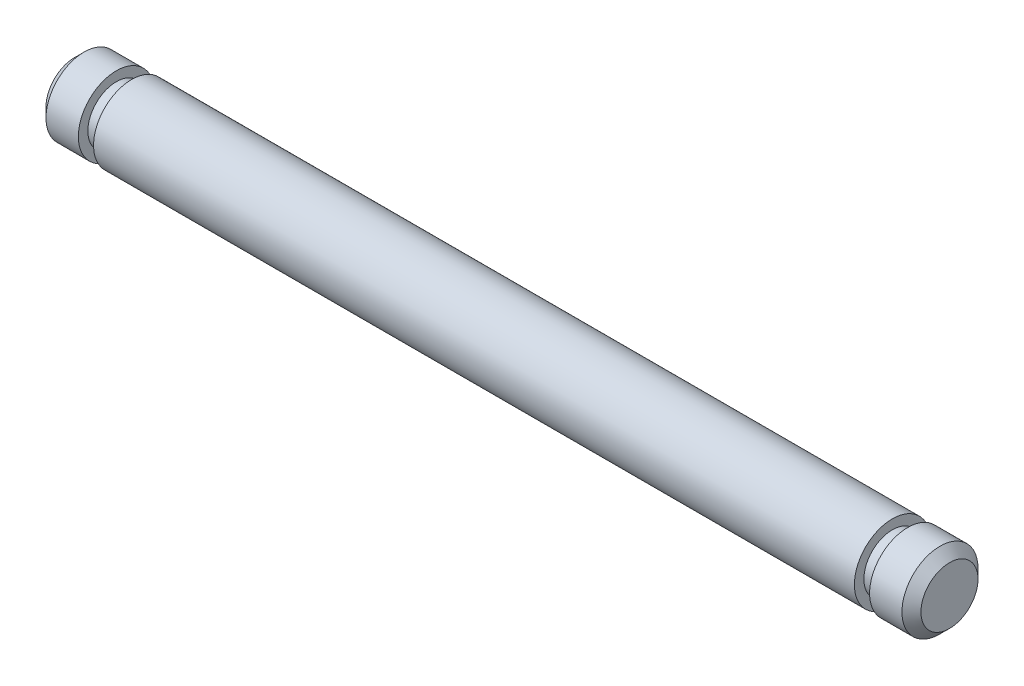
ISO-10303-21;
HEADER;
FILE_DESCRIPTION(('STEP AP214'),'2;1');
FILE_NAME('part.step','',(''),(''),'','','');
FILE_SCHEMA(('AUTOMOTIVE_DESIGN { 1 0 10303 214 1 1 1 1 }'));
ENDSEC;
DATA;
#1=APPLICATION_CONTEXT('core data for automotive mechanical design processes');
#2=APPLICATION_PROTOCOL_DEFINITION('international standard','automotive_design',2000,#1);
#3=PRODUCT_CONTEXT('',#1,'mechanical');
#4=PRODUCT('Part','Part','',(#3));
#5=PRODUCT_RELATED_PRODUCT_CATEGORY('part','',(#4));
#6=PRODUCT_DEFINITION_FORMATION('','',#4);
#7=PRODUCT_DEFINITION_CONTEXT('part definition',#1,'design');
#8=PRODUCT_DEFINITION('design','',#6,#7);
#9=PRODUCT_DEFINITION_SHAPE('','',#8);
#10=(LENGTH_UNIT() NAMED_UNIT(*) SI_UNIT(.MILLI.,.METRE.));
#11=(NAMED_UNIT(*) PLANE_ANGLE_UNIT() SI_UNIT($,.RADIAN.));
#12=(NAMED_UNIT(*) SI_UNIT($,.STERADIAN.) SOLID_ANGLE_UNIT());
#13=UNCERTAINTY_MEASURE_WITH_UNIT(LENGTH_MEASURE(1.E-05),#10,'distance_accuracy_value','');
#14=(GEOMETRIC_REPRESENTATION_CONTEXT(3) GLOBAL_UNCERTAINTY_ASSIGNED_CONTEXT((#13)) GLOBAL_UNIT_ASSIGNED_CONTEXT((#10,
#11,#12)) REPRESENTATION_CONTEXT('',''));
#15=CARTESIAN_POINT('',(0.,0.,0.));
#16=DIRECTION('',(0.,0.,1.));
#17=DIRECTION('',(1.,0.,0.));
#18=AXIS2_PLACEMENT_3D('',#15,#16,#17);
#19=CARTESIAN_POINT('',(20.,0.,0.));
#20=DIRECTION('',(-1.,0.,0.));
#21=DIRECTION('',(0.,0.,1.));
#22=AXIS2_PLACEMENT_3D('',#19,#20,#21);
#23=CYLINDRICAL_SURFACE('',#22,2.);
#24=CARTESIAN_POINT('',(20.,0.,0.));
#25=DIRECTION('',(1.,0.,0.));
#26=DIRECTION('',(0.,0.,-1.));
#27=AXIS2_PLACEMENT_3D('',#24,#25,#26);
#28=CIRCLE('',#27,2.);
#29=CARTESIAN_POINT('',(20.,0.,-2.));
#30=VERTEX_POINT('',#29);
#31=EDGE_CURVE('E72',#30,#30,#28,.T.);
#32=ORIENTED_EDGE('',*,*,#31,.F.);
#33=EDGE_LOOP('',(#32));
#34=FACE_BOUND('',#33,.T.);
#35=CARTESIAN_POINT('',(-20.,0.,0.));
#36=DIRECTION('',(1.,0.,0.));
#37=DIRECTION('',(0.,0.,-1.));
#38=AXIS2_PLACEMENT_3D('',#35,#36,#37);
#39=CIRCLE('',#38,2.);
#40=CARTESIAN_POINT('',(-20.,0.,-2.));
#41=VERTEX_POINT('',#40);
#42=EDGE_CURVE('E68',#41,#41,#39,.T.);
#43=ORIENTED_EDGE('',*,*,#42,.T.);
#44=EDGE_LOOP('',(#43));
#45=FACE_BOUND('',#44,.T.);
#46=ADVANCED_FACE('F42',(#34,#45),#23,.T.);
#47=CARTESIAN_POINT('',(20.,0.,0.));
#48=DIRECTION('',(1.,0.,0.));
#49=DIRECTION('',(0.,0.,-1.));
#50=AXIS2_PLACEMENT_3D('',#47,#48,#49);
#51=PLANE('',#50);
#52=CARTESIAN_POINT('',(20.,0.,0.));
#53=DIRECTION('',(1.,0.,0.));
#54=DIRECTION('',(0.,0.,-1.));
#55=AXIS2_PLACEMENT_3D('',#52,#53,#54);
#56=CIRCLE('',#55,1.5);
#57=CARTESIAN_POINT('',(20.,0.,-1.5));
#58=VERTEX_POINT('',#57);
#59=EDGE_CURVE('E67',#58,#58,#56,.T.);
#60=ORIENTED_EDGE('',*,*,#59,.F.);
#61=EDGE_LOOP('',(#60));
#62=FACE_BOUND('',#61,.T.);
#63=ORIENTED_EDGE('',*,*,#31,.T.);
#64=EDGE_LOOP('',(#63));
#65=FACE_BOUND('',#64,.T.);
#66=ADVANCED_FACE('F119',(#62,#65),#51,.T.);
#67=CARTESIAN_POINT('',(-20.,0.,0.));
#68=DIRECTION('',(1.,0.,0.));
#69=DIRECTION('',(0.,0.,-1.));
#70=AXIS2_PLACEMENT_3D('',#67,#68,#69);
#71=PLANE('',#70);
#72=CARTESIAN_POINT('',(-20.,0.,0.));
#73=DIRECTION('',(1.,0.,0.));
#74=DIRECTION('',(0.,0.,-1.));
#75=AXIS2_PLACEMENT_3D('',#72,#73,#74);
#76=CIRCLE('',#75,1.5);
#77=CARTESIAN_POINT('',(-20.,0.,-1.5));
#78=VERTEX_POINT('',#77);
#79=EDGE_CURVE('E87',#78,#78,#76,.T.);
#80=ORIENTED_EDGE('',*,*,#79,.T.);
#81=EDGE_LOOP('',(#80));
#82=FACE_BOUND('',#81,.T.);
#83=ORIENTED_EDGE('',*,*,#42,.F.);
#84=EDGE_LOOP('',(#83));
#85=FACE_BOUND('',#84,.T.);
#86=ADVANCED_FACE('F125',(#82,#85),#71,.F.);
#87=CARTESIAN_POINT('',(20.8,0.,0.));
#88=DIRECTION('',(-1.,0.,0.));
#89=DIRECTION('',(0.,0.,1.));
#90=AXIS2_PLACEMENT_3D('',#87,#88,#89);
#91=CYLINDRICAL_SURFACE('',#90,1.5);
#92=CARTESIAN_POINT('',(20.8,0.,0.));
#93=DIRECTION('',(1.,0.,0.));
#94=DIRECTION('',(0.,0.,-1.));
#95=AXIS2_PLACEMENT_3D('',#92,#93,#94);
#96=CIRCLE('',#95,1.5);
#97=CARTESIAN_POINT('',(20.8,0.,-1.5));
#98=VERTEX_POINT('',#97);
#99=EDGE_CURVE('E73',#98,#98,#96,.T.);
#100=ORIENTED_EDGE('',*,*,#99,.F.);
#101=EDGE_LOOP('',(#100));
#102=FACE_BOUND('',#101,.T.);
#103=ORIENTED_EDGE('',*,*,#59,.T.);
#104=EDGE_LOOP('',(#103));
#105=FACE_BOUND('',#104,.T.);
#106=ADVANCED_FACE('F154',(#102,#105),#91,.T.);
#107=CARTESIAN_POINT('',(23.,0.,0.));
#108=DIRECTION('',(-1.,0.,0.));
#109=DIRECTION('',(0.,0.,1.));
#110=AXIS2_PLACEMENT_3D('',#107,#108,#109);
#111=CYLINDRICAL_SURFACE('',#110,2.);
#112=CARTESIAN_POINT('',(22.5,0.,0.));
#113=DIRECTION('',(1.,0.,0.));
#114=DIRECTION('',(0.,0.,-1.));
#115=AXIS2_PLACEMENT_3D('',#112,#113,#114);
#116=CIRCLE('',#115,2.);
#117=CARTESIAN_POINT('',(22.5,0.,-2.));
#118=VERTEX_POINT('',#117);
#119=EDGE_CURVE('E10',#118,#118,#116,.F.);
#120=ORIENTED_EDGE('',*,*,#119,.T.);
#121=EDGE_LOOP('',(#120));
#122=FACE_BOUND('',#121,.T.);
#123=CARTESIAN_POINT('',(20.8,0.,0.));
#124=DIRECTION('',(1.,0.,0.));
#125=DIRECTION('',(0.,0.,-1.));
#126=AXIS2_PLACEMENT_3D('',#123,#124,#125);
#127=CIRCLE('',#126,2.);
#128=CARTESIAN_POINT('',(20.8,0.,-2.));
#129=VERTEX_POINT('',#128);
#130=EDGE_CURVE('E83',#129,#129,#127,.T.);
#131=ORIENTED_EDGE('',*,*,#130,.T.);
#132=EDGE_LOOP('',(#131));
#133=FACE_BOUND('',#132,.T.);
#134=ADVANCED_FACE('F159',(#122,#133),#111,.T.);
#135=CARTESIAN_POINT('',(23.,0.,0.));
#136=DIRECTION('',(1.,0.,0.));
#137=DIRECTION('',(0.,0.,-1.));
#138=AXIS2_PLACEMENT_3D('',#135,#136,#137);
#139=PLANE('',#138);
#140=CARTESIAN_POINT('',(23.,0.,0.));
#141=DIRECTION('',(1.,0.,0.));
#142=DIRECTION('',(0.,0.,-1.));
#143=AXIS2_PLACEMENT_3D('',#140,#141,#142);
#144=CIRCLE('',#143,1.49999999999999);
#145=CARTESIAN_POINT('',(23.,0.,-1.49999999999999));
#146=VERTEX_POINT('',#145);
#147=EDGE_CURVE('E51',#146,#146,#144,.T.);
#148=ORIENTED_EDGE('',*,*,#147,.T.);
#149=EDGE_LOOP('',(#148));
#150=FACE_BOUND('',#149,.T.);
#151=ADVANCED_FACE('F165',(#150),#139,.T.);
#152=CARTESIAN_POINT('',(20.8,0.,0.));
#153=DIRECTION('',(1.,0.,0.));
#154=DIRECTION('',(0.,0.,-1.));
#155=AXIS2_PLACEMENT_3D('',#152,#153,#154);
#156=PLANE('',#155);
#157=ORIENTED_EDGE('',*,*,#99,.T.);
#158=EDGE_LOOP('',(#157));
#159=FACE_BOUND('',#158,.T.);
#160=ORIENTED_EDGE('',*,*,#130,.F.);
#161=EDGE_LOOP('',(#160));
#162=FACE_BOUND('',#161,.T.);
#163=ADVANCED_FACE('F114',(#159,#162),#156,.F.);
#164=CARTESIAN_POINT('',(-20.8,0.,0.));
#165=DIRECTION('',(1.,0.,0.));
#166=DIRECTION('',(0.,0.,-1.));
#167=AXIS2_PLACEMENT_3D('',#164,#165,#166);
#168=CYLINDRICAL_SURFACE('',#167,1.5);
#169=CARTESIAN_POINT('',(-20.8,0.,0.));
#170=DIRECTION('',(1.,0.,0.));
#171=DIRECTION('',(0.,0.,-1.));
#172=AXIS2_PLACEMENT_3D('',#169,#170,#171);
#173=CIRCLE('',#172,1.5);
#174=CARTESIAN_POINT('',(-20.8,0.,-1.5));
#175=VERTEX_POINT('',#174);
#176=EDGE_CURVE('E91',#175,#175,#173,.T.);
#177=ORIENTED_EDGE('',*,*,#176,.T.);
#178=EDGE_LOOP('',(#177));
#179=FACE_BOUND('',#178,.T.);
#180=ORIENTED_EDGE('',*,*,#79,.F.);
#181=EDGE_LOOP('',(#180));
#182=FACE_BOUND('',#181,.T.);
#183=ADVANCED_FACE('F105',(#179,#182),#168,.T.);
#184=CARTESIAN_POINT('',(-23.,0.,0.));
#185=DIRECTION('',(1.,0.,0.));
#186=DIRECTION('',(0.,0.,-1.));
#187=AXIS2_PLACEMENT_3D('',#184,#185,#186);
#188=CYLINDRICAL_SURFACE('',#187,2.);
#189=CARTESIAN_POINT('',(-22.5,0.,0.));
#190=DIRECTION('',(-1.,0.,0.));
#191=DIRECTION('',(0.,0.,1.));
#192=AXIS2_PLACEMENT_3D('',#189,#190,#191);
#193=CIRCLE('',#192,2.);
#194=CARTESIAN_POINT('',(-22.5,0.,2.));
#195=VERTEX_POINT('',#194);
#196=EDGE_CURVE('E61',#195,#195,#193,.F.);
#197=ORIENTED_EDGE('',*,*,#196,.T.);
#198=EDGE_LOOP('',(#197));
#199=FACE_BOUND('',#198,.T.);
#200=CARTESIAN_POINT('',(-20.8,0.,0.));
#201=DIRECTION('',(1.,0.,0.));
#202=DIRECTION('',(0.,0.,-1.));
#203=AXIS2_PLACEMENT_3D('',#200,#201,#202);
#204=CIRCLE('',#203,2.);
#205=CARTESIAN_POINT('',(-20.8,0.,-2.));
#206=VERTEX_POINT('',#205);
#207=EDGE_CURVE('E95',#206,#206,#204,.T.);
#208=ORIENTED_EDGE('',*,*,#207,.F.);
#209=EDGE_LOOP('',(#208));
#210=FACE_BOUND('',#209,.T.);
#211=ADVANCED_FACE('F102',(#199,#210),#188,.T.);
#212=CARTESIAN_POINT('',(-23.,0.,0.));
#213=DIRECTION('',(-1.,0.,0.));
#214=DIRECTION('',(0.,0.,-1.));
#215=AXIS2_PLACEMENT_3D('',#212,#213,#214);
#216=PLANE('',#215);
#217=CARTESIAN_POINT('',(-23.,0.,0.));
#218=DIRECTION('',(-1.,0.,0.));
#219=DIRECTION('',(0.,0.,1.));
#220=AXIS2_PLACEMENT_3D('',#217,#218,#219);
#221=CIRCLE('',#220,1.50000000000001);
#222=CARTESIAN_POINT('',(-23.,0.,1.50000000000001));
#223=VERTEX_POINT('',#222);
#224=EDGE_CURVE('E56',#223,#223,#221,.T.);
#225=ORIENTED_EDGE('',*,*,#224,.T.);
#226=EDGE_LOOP('',(#225));
#227=FACE_BOUND('',#226,.T.);
#228=ADVANCED_FACE('F104',(#227),#216,.T.);
#229=CARTESIAN_POINT('',(-20.8,0.,0.));
#230=DIRECTION('',(-1.,0.,0.));
#231=DIRECTION('',(0.,0.,-1.));
#232=AXIS2_PLACEMENT_3D('',#229,#230,#231);
#233=PLANE('',#232);
#234=ORIENTED_EDGE('',*,*,#176,.F.);
#235=EDGE_LOOP('',(#234));
#236=FACE_BOUND('',#235,.T.);
#237=ORIENTED_EDGE('',*,*,#207,.T.);
#238=EDGE_LOOP('',(#237));
#239=FACE_BOUND('',#238,.T.);
#240=ADVANCED_FACE('F100',(#236,#239),#233,.F.);
#241=CARTESIAN_POINT('',(-22.5,0.,0.));
#242=DIRECTION('',(1.,0.,0.));
#243=DIRECTION('',(0.,0.,-1.));
#244=AXIS2_PLACEMENT_3D('',#241,#242,#243);
#245=CONICAL_SURFACE('',#244,2.,0.785398163397454);
#246=ORIENTED_EDGE('',*,*,#224,.F.);
#247=EDGE_LOOP('',(#246));
#248=FACE_BOUND('',#247,.T.);
#249=ORIENTED_EDGE('',*,*,#196,.F.);
#250=EDGE_LOOP('',(#249));
#251=FACE_BOUND('',#250,.T.);
#252=ADVANCED_FACE('F132',(#248,#251),#245,.T.);
#253=CARTESIAN_POINT('',(23.,0.,0.));
#254=DIRECTION('',(-1.,0.,0.));
#255=DIRECTION('',(0.,0.,1.));
#256=AXIS2_PLACEMENT_3D('',#253,#254,#255);
#257=CONICAL_SURFACE('',#256,1.49999999999999,0.785398163397453);
#258=ORIENTED_EDGE('',*,*,#119,.F.);
#259=EDGE_LOOP('',(#258));
#260=FACE_BOUND('',#259,.T.);
#261=ORIENTED_EDGE('',*,*,#147,.F.);
#262=EDGE_LOOP('',(#261));
#263=FACE_BOUND('',#262,.T.);
#264=ADVANCED_FACE('F45',(#260,#263),#257,.T.);
#265=CLOSED_SHELL('',(#46,#66,#86,#106,#134,#151,#163,#183,#211,#228,#240,#252,#264));
#266=MANIFOLD_SOLID_BREP('B2',#265);
#267=ADVANCED_BREP_SHAPE_REPRESENTATION('',(#18,#266),#14);
#268=SHAPE_DEFINITION_REPRESENTATION(#9,#267);
ENDSEC;
END-ISO-10303-21;
